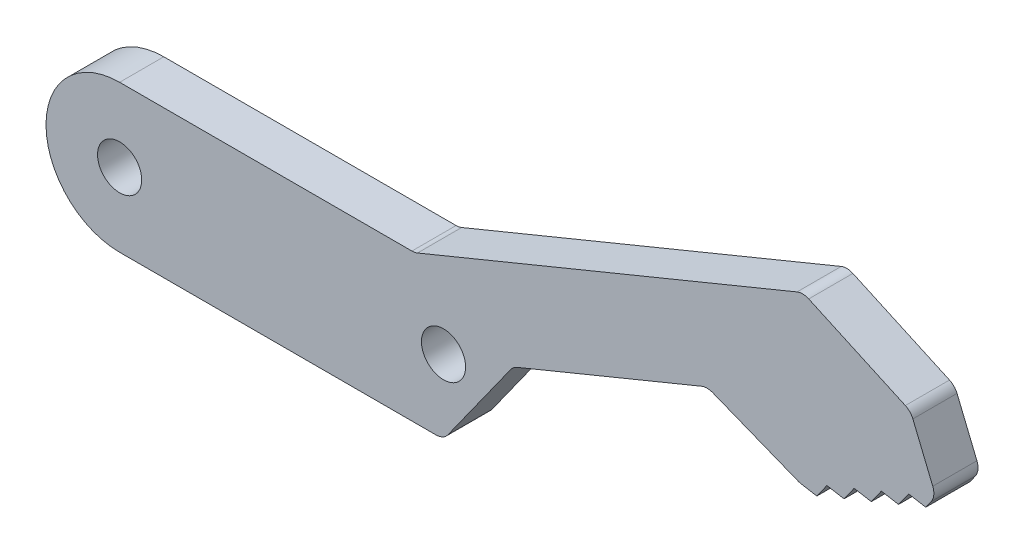
ISO-10303-21;
HEADER;
FILE_DESCRIPTION(('STEP AP214'),'2;1');
FILE_NAME('part.step','',(''),(''),'','','');
FILE_SCHEMA(('AUTOMOTIVE_DESIGN { 1 0 10303 214 1 1 1 1 }'));
ENDSEC;
DATA;
#1=APPLICATION_CONTEXT('core data for automotive mechanical design processes');
#2=APPLICATION_PROTOCOL_DEFINITION('international standard','automotive_design',2000,#1);
#3=PRODUCT_CONTEXT('',#1,'mechanical');
#4=PRODUCT('Part','Part','',(#3));
#5=PRODUCT_RELATED_PRODUCT_CATEGORY('part','',(#4));
#6=PRODUCT_DEFINITION_FORMATION('','',#4);
#7=PRODUCT_DEFINITION_CONTEXT('part definition',#1,'design');
#8=PRODUCT_DEFINITION('design','',#6,#7);
#9=PRODUCT_DEFINITION_SHAPE('','',#8);
#10=(LENGTH_UNIT() NAMED_UNIT(*) SI_UNIT(.MILLI.,.METRE.));
#11=(NAMED_UNIT(*) PLANE_ANGLE_UNIT() SI_UNIT($,.RADIAN.));
#12=(NAMED_UNIT(*) SI_UNIT($,.STERADIAN.) SOLID_ANGLE_UNIT());
#13=UNCERTAINTY_MEASURE_WITH_UNIT(LENGTH_MEASURE(1.E-05),#10,'distance_accuracy_value','');
#14=(GEOMETRIC_REPRESENTATION_CONTEXT(3) GLOBAL_UNCERTAINTY_ASSIGNED_CONTEXT((#13)) GLOBAL_UNIT_ASSIGNED_CONTEXT((#10,
#11,#12)) REPRESENTATION_CONTEXT('',''));
#15=CARTESIAN_POINT('',(0.,0.,0.));
#16=DIRECTION('',(0.,0.,1.));
#17=DIRECTION('',(1.,0.,0.));
#18=AXIS2_PLACEMENT_3D('',#15,#16,#17);
#19=CARTESIAN_POINT('',(0.,0.,1.5));
#20=DIRECTION('',(0.,0.,1.));
#21=DIRECTION('',(1.,0.,0.));
#22=AXIS2_PLACEMENT_3D('',#19,#20,#21);
#23=PLANE('',#22);
#24=CARTESIAN_POINT('',(0.,0.,1.5));
#25=DIRECTION('',(0.,0.,1.));
#26=DIRECTION('',(1.,0.,0.));
#27=AXIS2_PLACEMENT_3D('',#24,#25,#26);
#28=CIRCLE('',#27,1.5);
#29=CARTESIAN_POINT('',(1.5,0.,1.5));
#30=VERTEX_POINT('',#29);
#31=EDGE_CURVE('E413',#30,#30,#28,.T.);
#32=ORIENTED_EDGE('',*,*,#31,.F.);
#33=EDGE_LOOP('',(#32));
#34=FACE_BOUND('',#33,.T.);
#35=DIRECTION('',(0.929454882621317,-0.368935795459582,0.));
#36=VECTOR('',#35,1.);
#37=CARTESIAN_POINT('',(46.1884880253804,4.54000704246279,1.5));
#38=LINE('',#37,#36);
#39=CARTESIAN_POINT('',(40.2756885375187,6.8870207848566,1.5));
#40=VERTEX_POINT('',#39);
#41=CARTESIAN_POINT('',(46.0925277874036,4.57809729019016,1.5));
#42=VERTEX_POINT('',#41);
#43=EDGE_CURVE('E379',#40,#42,#38,.T.);
#44=ORIENTED_EDGE('',*,*,#43,.T.);
#45=CARTESIAN_POINT('',(46.4614635828631,5.50755217281148,1.5));
#46=DIRECTION('',(0.,0.,1.));
#47=DIRECTION('',(1.,0.,0.));
#48=AXIS2_PLACEMENT_3D('',#45,#46,#47);
#49=CIRCLE('',#48,1.);
#50=CARTESIAN_POINT('',(46.2902063078328,4.52232583041641,1.5));
#51=VERTEX_POINT('',#50);
#52=EDGE_CURVE('E307',#42,#51,#49,.T.);
#53=ORIENTED_EDGE('',*,*,#52,.T.);
#54=DIRECTION('',(0.985226342395072,-0.17125727503037,0.));
#55=VECTOR('',#54,1.);
#56=CARTESIAN_POINT('',(46.1884880253804,4.54000704246279,1.5));
#57=LINE('',#56,#55);
#58=CARTESIAN_POINT('',(47.3529322035688,4.33759717145107,1.5));
#59=VERTEX_POINT('',#58);
#60=EDGE_CURVE('E384',#51,#59,#57,.T.);
#61=ORIENTED_EDGE('',*,*,#60,.T.);
#62=DIRECTION('',(0.579836905746106,0.814732571298571,0.));
#63=VECTOR('',#62,1.);
#64=CARTESIAN_POINT('',(47.3529322035688,4.33759717145107,1.5));
#65=LINE('',#64,#63);
#66=CARTESIAN_POINT('',(48.0382444817134,5.3005338679292,1.5));
#67=VERTEX_POINT('',#66);
#68=EDGE_CURVE('E392',#59,#67,#65,.T.);
#69=ORIENTED_EDGE('',*,*,#68,.T.);
#70=DIRECTION('',(0.985226342395072,-0.171257275030373,0.));
#71=VECTOR('',#70,1.);
#72=CARTESIAN_POINT('',(48.0382444817134,5.3005338679292,1.5));
#73=LINE('',#72,#71);
#74=CARTESIAN_POINT('',(49.2026886599019,5.09812399691748,1.5));
#75=VERTEX_POINT('',#74);
#76=EDGE_CURVE('E395',#67,#75,#73,.T.);
#77=ORIENTED_EDGE('',*,*,#76,.T.);
#78=DIRECTION('',(0.579836905746101,0.814732571298575,0.));
#79=VECTOR('',#78,1.);
#80=CARTESIAN_POINT('',(49.2026886599019,5.09812399691748,1.5));
#81=LINE('',#80,#79);
#82=CARTESIAN_POINT('',(49.8880009380465,6.06106069339563,1.5));
#83=VERTEX_POINT('',#82);
#84=EDGE_CURVE('E398',#75,#83,#81,.T.);
#85=ORIENTED_EDGE('',*,*,#84,.T.);
#86=DIRECTION('',(0.98522634239507,-0.171257275030381,0.));
#87=VECTOR('',#86,1.);
#88=CARTESIAN_POINT('',(49.8880009380465,6.06106069339563,1.5));
#89=LINE('',#88,#87);
#90=CARTESIAN_POINT('',(51.052445116235,5.85865082238389,1.5));
#91=VERTEX_POINT('',#90);
#92=EDGE_CURVE('E401',#83,#91,#89,.T.);
#93=ORIENTED_EDGE('',*,*,#92,.T.);
#94=DIRECTION('',(0.579836905746102,0.814732571298574,0.));
#95=VECTOR('',#94,1.);
#96=CARTESIAN_POINT('',(51.052445116235,5.85865082238389,1.5));
#97=LINE('',#96,#95);
#98=CARTESIAN_POINT('',(51.7377573943796,6.82158751886203,1.5));
#99=VERTEX_POINT('',#98);
#100=EDGE_CURVE('E404',#91,#99,#97,.T.);
#101=ORIENTED_EDGE('',*,*,#100,.T.);
#102=DIRECTION('',(0.985226342395074,-0.171257275030362,0.));
#103=VECTOR('',#102,1.);
#104=CARTESIAN_POINT('',(51.7377573943796,6.82158751886203,1.5));
#105=LINE('',#104,#103);
#106=CARTESIAN_POINT('',(52.9022015725681,6.61917764785031,1.5));
#107=VERTEX_POINT('',#106);
#108=EDGE_CURVE('E241',#99,#107,#105,.T.);
#109=ORIENTED_EDGE('',*,*,#108,.T.);
#110=DIRECTION('',(0.579836905746106,0.814732571298571,0.));
#111=VECTOR('',#110,1.);
#112=CARTESIAN_POINT('',(52.9022015725681,6.61917764785031,1.5));
#113=LINE('',#112,#111);
#114=CARTESIAN_POINT('',(53.5875138507128,7.58211434432844,1.5));
#115=VERTEX_POINT('',#114);
#116=EDGE_CURVE('E235',#107,#115,#113,.T.);
#117=ORIENTED_EDGE('',*,*,#116,.T.);
#118=DIRECTION('',(0.98522634239507,-0.171257275030384,0.));
#119=VECTOR('',#118,1.);
#120=CARTESIAN_POINT('',(53.5875138507128,7.58211434432844,1.5));
#121=LINE('',#120,#119);
#122=CARTESIAN_POINT('',(54.7519580289012,7.37970447331671,1.5));
#123=VERTEX_POINT('',#122);
#124=EDGE_CURVE('E223',#115,#123,#121,.T.);
#125=ORIENTED_EDGE('',*,*,#124,.T.);
#126=DIRECTION('',(0.579836905746103,0.814732571298573,0.));
#127=VECTOR('',#126,1.);
#128=CARTESIAN_POINT('',(54.7519580289012,7.37970447331671,1.5));
#129=LINE('',#128,#127);
#130=CARTESIAN_POINT('',(55.1172552795213,7.89298599323483,1.5));
#131=VERTEX_POINT('',#130);
#132=EDGE_CURVE('E234',#123,#131,#129,.T.);
#133=ORIENTED_EDGE('',*,*,#132,.T.);
#134=CARTESIAN_POINT('',(54.3025227082227,8.47282289898093,1.5));
#135=DIRECTION('',(0.,0.,1.));
#136=DIRECTION('',(1.,0.,0.));
#137=AXIS2_PLACEMENT_3D('',#134,#135,#136);
#138=CIRCLE('',#137,1.);
#139=CARTESIAN_POINT('',(55.2274009363892,8.85308631171413,1.5));
#140=VERTEX_POINT('',#139);
#141=EDGE_CURVE('E295',#131,#140,#138,.T.);
#142=ORIENTED_EDGE('',*,*,#141,.T.);
#143=DIRECTION('',(-0.380263412733207,0.924878228166549,0.));
#144=VECTOR('',#143,1.);
#145=CARTESIAN_POINT('',(53.7260849497464,12.5045931965443,1.5));
#146=LINE('',#145,#144);
#147=CARTESIAN_POINT('',(53.8764912996726,12.138774256918,1.5));
#148=VERTEX_POINT('',#147);
#149=EDGE_CURVE('E532',#140,#148,#146,.T.);
#150=ORIENTED_EDGE('',*,*,#149,.T.);
#151=CARTESIAN_POINT('',(52.9516130715061,11.7585108441848,1.5));
#152=DIRECTION('',(0.,0.,1.));
#153=DIRECTION('',(1.,0.,0.));
#154=AXIS2_PLACEMENT_3D('',#151,#152,#153);
#155=CIRCLE('',#154,1.);
#156=CARTESIAN_POINT('',(53.3661353314382,12.6685500169795,1.5));
#157=VERTEX_POINT('',#156);
#158=EDGE_CURVE('E298',#148,#157,#155,.T.);
#159=ORIENTED_EDGE('',*,*,#158,.T.);
#160=DIRECTION('',(-0.910039172794664,0.414522259932086,0.));
#161=VECTOR('',#160,1.);
#162=CARTESIAN_POINT('',(46.4090295027466,15.8375072628964,1.5));
#163=LINE('',#162,#161);
#164=CARTESIAN_POINT('',(46.8032086062433,15.6579589338968,1.5));
#165=VERTEX_POINT('',#164);
#166=EDGE_CURVE('E528',#157,#165,#163,.T.);
#167=ORIENTED_EDGE('',*,*,#166,.T.);
#168=CARTESIAN_POINT('',(46.3886863463112,14.7479197611021,1.5));
#169=DIRECTION('',(0.,0.,1.));
#170=DIRECTION('',(1.,0.,0.));
#171=AXIS2_PLACEMENT_3D('',#168,#169,#170);
#172=CIRCLE('',#171,1.);
#173=CARTESIAN_POINT('',(46.008422933578,15.6727979892687,1.5));
#174=VERTEX_POINT('',#173);
#175=EDGE_CURVE('E301',#165,#174,#172,.T.);
#176=ORIENTED_EDGE('',*,*,#175,.T.);
#177=DIRECTION('',(-0.924878228166549,-0.380263412733207,0.));
#178=VECTOR('',#177,1.);
#179=CARTESIAN_POINT('',(20.05,5.,1.5));
#180=LINE('',#179,#178);
#181=CARTESIAN_POINT('',(20.2327114807882,5.07512177183345,1.5));
#182=VERTEX_POINT('',#181);
#183=EDGE_CURVE('E524',#174,#182,#180,.T.);
#184=ORIENTED_EDGE('',*,*,#183,.T.);
#185=CARTESIAN_POINT('',(19.852448068055,6.,1.5));
#186=DIRECTION('',(0.,0.,1.));
#187=DIRECTION('',(1.,0.,0.));
#188=AXIS2_PLACEMENT_3D('',#185,#186,#187);
#189=CIRCLE('',#188,1.);
#190=CARTESIAN_POINT('',(19.852448068055,5.,1.5));
#191=VERTEX_POINT('',#190);
#192=EDGE_CURVE('E346',#182,#191,#189,.F.);
#193=ORIENTED_EDGE('',*,*,#192,.T.);
#194=DIRECTION('',(-1.,0.,0.));
#195=VECTOR('',#194,1.);
#196=CARTESIAN_POINT('',(0.,5.,1.5));
#197=LINE('',#196,#195);
#198=CARTESIAN_POINT('',(0.,5.,1.5));
#199=VERTEX_POINT('',#198);
#200=EDGE_CURVE('E519',#191,#199,#197,.T.);
#201=ORIENTED_EDGE('',*,*,#200,.T.);
#202=CARTESIAN_POINT('',(0.,0.,1.5));
#203=DIRECTION('',(0.,0.,1.));
#204=DIRECTION('',(1.,0.,0.));
#205=AXIS2_PLACEMENT_3D('',#202,#203,#204);
#206=CIRCLE('',#205,5.);
#207=CARTESIAN_POINT('',(0.,-5.,1.5));
#208=VERTEX_POINT('',#207);
#209=EDGE_CURVE('E504',#199,#208,#206,.T.);
#210=ORIENTED_EDGE('',*,*,#209,.T.);
#211=DIRECTION('',(1.,0.,0.));
#212=VECTOR('',#211,1.);
#213=CARTESIAN_POINT('',(0.,-5.,1.5));
#214=LINE('',#213,#212);
#215=CARTESIAN_POINT('',(21.4854150030195,-5.,1.5));
#216=VERTEX_POINT('',#215);
#217=EDGE_CURVE('E386',#208,#216,#214,.T.);
#218=ORIENTED_EDGE('',*,*,#217,.T.);
#219=CARTESIAN_POINT('',(21.4854150030195,-4.,1.5));
#220=DIRECTION('',(0.,0.,1.));
#221=DIRECTION('',(1.,0.,0.));
#222=AXIS2_PLACEMENT_3D('',#219,#220,#221);
#223=CIRCLE('',#222,1.);
#224=CARTESIAN_POINT('',(22.2991182366711,-4.58128052396836,1.5));
#225=VERTEX_POINT('',#224);
#226=EDGE_CURVE('E304',#216,#225,#223,.T.);
#227=ORIENTED_EDGE('',*,*,#226,.T.);
#228=DIRECTION('',(0.581280523968354,0.813703233651603,0.));
#229=VECTOR('',#228,1.);
#230=CARTESIAN_POINT('',(26.7298984201175,1.62112952455076,1.5));
#231=LINE('',#230,#229);
#232=CARTESIAN_POINT('',(26.562618493048,1.38696338278466,1.5));
#233=VERTEX_POINT('',#232);
#234=EDGE_CURVE('E380',#225,#233,#231,.T.);
#235=ORIENTED_EDGE('',*,*,#234,.T.);
#236=CARTESIAN_POINT('',(27.3763217266996,0.805682858816303,1.5));
#237=DIRECTION('',(0.,0.,1.));
#238=DIRECTION('',(1.,0.,0.));
#239=AXIS2_PLACEMENT_3D('',#236,#237,#238);
#240=CIRCLE('',#239,1.);
#241=CARTESIAN_POINT('',(26.9960583139664,1.73056108698285,1.5));
#242=VERTEX_POINT('',#241);
#243=EDGE_CURVE('E11',#233,#242,#240,.F.);
#244=ORIENTED_EDGE('',*,*,#243,.T.);
#245=DIRECTION('',(0.924878228166549,0.380263412733207,0.));
#246=VECTOR('',#245,1.);
#247=CARTESIAN_POINT('',(39.9001643892091,7.03608052187162,1.5));
#248=LINE('',#247,#246);
#249=CARTESIAN_POINT('',(39.5264893293259,6.88244413040182,1.5));
#250=VERTEX_POINT('',#249);
#251=EDGE_CURVE('E376',#242,#250,#248,.T.);
#252=ORIENTED_EDGE('',*,*,#251,.T.);
#253=CARTESIAN_POINT('',(39.9067527420591,5.95756590223528,1.5));
#254=DIRECTION('',(0.,0.,1.));
#255=DIRECTION('',(1.,0.,0.));
#256=AXIS2_PLACEMENT_3D('',#253,#254,#255);
#257=CIRCLE('',#256,1.);
#258=EDGE_CURVE('E352',#250,#40,#257,.F.);
#259=ORIENTED_EDGE('',*,*,#258,.T.);
#260=EDGE_LOOP('',(#44,#53,#61,#69,#77,#85,#93,#101,#109,#117,#125,#133,#142,#150,#159,#167,
#176,#184,#193,#201,#210,#218,#227,#235,#244,#252,#259));
#261=FACE_BOUND('',#260,.T.);
#262=CARTESIAN_POINT('',(22.,0.,1.5));
#263=DIRECTION('',(0.,0.,1.));
#264=DIRECTION('',(1.,0.,0.));
#265=AXIS2_PLACEMENT_3D('',#262,#263,#264);
#266=CIRCLE('',#265,1.5);
#267=CARTESIAN_POINT('',(23.5,0.,1.5));
#268=VERTEX_POINT('',#267);
#269=EDGE_CURVE('E542',#268,#268,#266,.T.);
#270=ORIENTED_EDGE('',*,*,#269,.F.);
#271=EDGE_LOOP('',(#270));
#272=FACE_BOUND('',#271,.T.);
#273=ADVANCED_FACE('F43',(#34,#261,#272),#23,.T.);
#274=CARTESIAN_POINT('',(0.,0.,-1.5));
#275=DIRECTION('',(0.,0.,1.));
#276=DIRECTION('',(1.,0.,0.));
#277=AXIS2_PLACEMENT_3D('',#274,#275,#276);
#278=PLANE('',#277);
#279=DIRECTION('',(0.985226342395072,-0.17125727503037,0.));
#280=VECTOR('',#279,1.);
#281=CARTESIAN_POINT('',(46.1884880253804,4.54000704246279,-1.5));
#282=LINE('',#281,#280);
#283=CARTESIAN_POINT('',(46.2902063078328,4.52232583041641,-1.5));
#284=VERTEX_POINT('',#283);
#285=CARTESIAN_POINT('',(47.3529322035688,4.33759717145107,-1.5));
#286=VERTEX_POINT('',#285);
#287=EDGE_CURVE('E447',#284,#286,#282,.T.);
#288=ORIENTED_EDGE('',*,*,#287,.F.);
#289=CARTESIAN_POINT('',(46.4614635828631,5.50755217281148,-1.5));
#290=DIRECTION('',(0.,0.,1.));
#291=DIRECTION('',(1.,0.,0.));
#292=AXIS2_PLACEMENT_3D('',#289,#290,#291);
#293=CIRCLE('',#292,1.);
#294=CARTESIAN_POINT('',(46.0925277874036,4.57809729019016,-1.5));
#295=VERTEX_POINT('',#294);
#296=EDGE_CURVE('E285',#284,#295,#293,.F.);
#297=ORIENTED_EDGE('',*,*,#296,.T.);
#298=DIRECTION('',(0.929454882621317,-0.368935795459582,0.));
#299=VECTOR('',#298,1.);
#300=CARTESIAN_POINT('',(46.1884880253804,4.54000704246279,-1.5));
#301=LINE('',#300,#299);
#302=CARTESIAN_POINT('',(40.2756885375187,6.8870207848566,-1.5));
#303=VERTEX_POINT('',#302);
#304=EDGE_CURVE('E443',#303,#295,#301,.T.);
#305=ORIENTED_EDGE('',*,*,#304,.F.);
#306=CARTESIAN_POINT('',(39.9067527420591,5.95756590223528,-1.5));
#307=DIRECTION('',(0.,0.,1.));
#308=DIRECTION('',(1.,0.,0.));
#309=AXIS2_PLACEMENT_3D('',#306,#307,#308);
#310=CIRCLE('',#309,1.);
#311=CARTESIAN_POINT('',(39.5264893293259,6.88244413040182,-1.5));
#312=VERTEX_POINT('',#311);
#313=EDGE_CURVE('E349',#303,#312,#310,.T.);
#314=ORIENTED_EDGE('',*,*,#313,.T.);
#315=DIRECTION('',(0.924878228166549,0.380263412733207,0.));
#316=VECTOR('',#315,1.);
#317=CARTESIAN_POINT('',(39.9001643892091,7.03608052187162,-1.5));
#318=LINE('',#317,#316);
#319=CARTESIAN_POINT('',(26.9960583139664,1.73056108698285,-1.5));
#320=VERTEX_POINT('',#319);
#321=EDGE_CURVE('E363',#320,#312,#318,.T.);
#322=ORIENTED_EDGE('',*,*,#321,.F.);
#323=CARTESIAN_POINT('',(27.3763217266996,0.805682858816303,-1.5));
#324=DIRECTION('',(0.,0.,1.));
#325=DIRECTION('',(1.,0.,0.));
#326=AXIS2_PLACEMENT_3D('',#323,#324,#325);
#327=CIRCLE('',#326,1.);
#328=CARTESIAN_POINT('',(26.562618493048,1.38696338278466,-1.5));
#329=VERTEX_POINT('',#328);
#330=EDGE_CURVE('E52',#320,#329,#327,.T.);
#331=ORIENTED_EDGE('',*,*,#330,.T.);
#332=DIRECTION('',(0.581280523968354,0.813703233651603,0.));
#333=VECTOR('',#332,1.);
#334=CARTESIAN_POINT('',(26.7298984201175,1.62112952455076,-1.5));
#335=LINE('',#334,#333);
#336=CARTESIAN_POINT('',(22.2991182366711,-4.58128052396836,-1.5));
#337=VERTEX_POINT('',#336);
#338=EDGE_CURVE('E362',#337,#329,#335,.T.);
#339=ORIENTED_EDGE('',*,*,#338,.F.);
#340=CARTESIAN_POINT('',(21.4854150030195,-4.,-1.5));
#341=DIRECTION('',(0.,0.,1.));
#342=DIRECTION('',(1.,0.,0.));
#343=AXIS2_PLACEMENT_3D('',#340,#341,#342);
#344=CIRCLE('',#343,1.);
#345=CARTESIAN_POINT('',(21.4854150030195,-5.,-1.5));
#346=VERTEX_POINT('',#345);
#347=EDGE_CURVE('E282',#337,#346,#344,.F.);
#348=ORIENTED_EDGE('',*,*,#347,.T.);
#349=DIRECTION('',(1.,0.,0.));
#350=VECTOR('',#349,1.);
#351=CARTESIAN_POINT('',(0.,-5.,-1.5));
#352=LINE('',#351,#350);
#353=CARTESIAN_POINT('',(0.,-5.,-1.5));
#354=VERTEX_POINT('',#353);
#355=EDGE_CURVE('E372',#354,#346,#352,.T.);
#356=ORIENTED_EDGE('',*,*,#355,.F.);
#357=CARTESIAN_POINT('',(0.,0.,-1.5));
#358=DIRECTION('',(0.,0.,1.));
#359=DIRECTION('',(1.,0.,0.));
#360=AXIS2_PLACEMENT_3D('',#357,#358,#359);
#361=CIRCLE('',#360,5.);
#362=CARTESIAN_POINT('',(0.,5.,-1.5));
#363=VERTEX_POINT('',#362);
#364=EDGE_CURVE('E435',#363,#354,#361,.T.);
#365=ORIENTED_EDGE('',*,*,#364,.F.);
#366=DIRECTION('',(-1.,0.,0.));
#367=VECTOR('',#366,1.);
#368=CARTESIAN_POINT('',(0.,5.,-1.5));
#369=LINE('',#368,#367);
#370=CARTESIAN_POINT('',(19.852448068055,5.,-1.5));
#371=VERTEX_POINT('',#370);
#372=EDGE_CURVE('E432',#371,#363,#369,.T.);
#373=ORIENTED_EDGE('',*,*,#372,.F.);
#374=CARTESIAN_POINT('',(19.852448068055,6.,-1.5));
#375=DIRECTION('',(0.,0.,1.));
#376=DIRECTION('',(1.,0.,0.));
#377=AXIS2_PLACEMENT_3D('',#374,#375,#376);
#378=CIRCLE('',#377,1.);
#379=CARTESIAN_POINT('',(20.2327114807882,5.07512177183345,-1.5));
#380=VERTEX_POINT('',#379);
#381=EDGE_CURVE('E343',#371,#380,#378,.T.);
#382=ORIENTED_EDGE('',*,*,#381,.T.);
#383=DIRECTION('',(-0.924878228166549,-0.380263412733207,0.));
#384=VECTOR('',#383,1.);
#385=CARTESIAN_POINT('',(20.05,5.,-1.5));
#386=LINE('',#385,#384);
#387=CARTESIAN_POINT('',(46.008422933578,15.6727979892687,-1.5));
#388=VERTEX_POINT('',#387);
#389=EDGE_CURVE('E428',#388,#380,#386,.T.);
#390=ORIENTED_EDGE('',*,*,#389,.F.);
#391=CARTESIAN_POINT('',(46.3886863463112,14.7479197611021,-1.5));
#392=DIRECTION('',(0.,0.,1.));
#393=DIRECTION('',(1.,0.,0.));
#394=AXIS2_PLACEMENT_3D('',#391,#392,#393);
#395=CIRCLE('',#394,1.);
#396=CARTESIAN_POINT('',(46.8032086062433,15.6579589338968,-1.5));
#397=VERTEX_POINT('',#396);
#398=EDGE_CURVE('E279',#388,#397,#395,.F.);
#399=ORIENTED_EDGE('',*,*,#398,.T.);
#400=DIRECTION('',(-0.910039172794664,0.414522259932086,0.));
#401=VECTOR('',#400,1.);
#402=CARTESIAN_POINT('',(46.4090295027466,15.8375072628964,-1.5));
#403=LINE('',#402,#401);
#404=CARTESIAN_POINT('',(53.3661353314382,12.6685500169795,-1.5));
#405=VERTEX_POINT('',#404);
#406=EDGE_CURVE('E424',#405,#397,#403,.T.);
#407=ORIENTED_EDGE('',*,*,#406,.F.);
#408=CARTESIAN_POINT('',(52.9516130715061,11.7585108441848,-1.5));
#409=DIRECTION('',(0.,0.,1.));
#410=DIRECTION('',(1.,0.,0.));
#411=AXIS2_PLACEMENT_3D('',#408,#409,#410);
#412=CIRCLE('',#411,1.);
#413=CARTESIAN_POINT('',(53.8764912996726,12.138774256918,-1.5));
#414=VERTEX_POINT('',#413);
#415=EDGE_CURVE('E276',#405,#414,#412,.F.);
#416=ORIENTED_EDGE('',*,*,#415,.T.);
#417=DIRECTION('',(-0.380263412733207,0.924878228166549,0.));
#418=VECTOR('',#417,1.);
#419=CARTESIAN_POINT('',(53.7260849497464,12.5045931965443,-1.5));
#420=LINE('',#419,#418);
#421=CARTESIAN_POINT('',(55.2274009363892,8.85308631171413,-1.5));
#422=VERTEX_POINT('',#421);
#423=EDGE_CURVE('E420',#422,#414,#420,.T.);
#424=ORIENTED_EDGE('',*,*,#423,.F.);
#425=CARTESIAN_POINT('',(54.3025227082227,8.47282289898093,-1.5));
#426=DIRECTION('',(0.,0.,1.));
#427=DIRECTION('',(1.,0.,0.));
#428=AXIS2_PLACEMENT_3D('',#425,#426,#427);
#429=CIRCLE('',#428,1.);
#430=CARTESIAN_POINT('',(55.1172552795213,7.89298599323483,-1.5));
#431=VERTEX_POINT('',#430);
#432=EDGE_CURVE('E273',#422,#431,#429,.F.);
#433=ORIENTED_EDGE('',*,*,#432,.T.);
#434=DIRECTION('',(0.579836905746103,0.814732571298573,0.));
#435=VECTOR('',#434,1.);
#436=CARTESIAN_POINT('',(54.7519580289012,7.37970447331671,-1.5));
#437=LINE('',#436,#435);
#438=CARTESIAN_POINT('',(54.7519580289012,7.37970447331671,-1.5));
#439=VERTEX_POINT('',#438);
#440=EDGE_CURVE('E416',#439,#431,#437,.T.);
#441=ORIENTED_EDGE('',*,*,#440,.F.);
#442=DIRECTION('',(0.98522634239507,-0.171257275030384,0.));
#443=VECTOR('',#442,1.);
#444=CARTESIAN_POINT('',(53.5875138507128,7.58211434432844,-1.5));
#445=LINE('',#444,#443);
#446=CARTESIAN_POINT('',(53.5875138507128,7.58211434432844,-1.5));
#447=VERTEX_POINT('',#446);
#448=EDGE_CURVE('E412',#447,#439,#445,.T.);
#449=ORIENTED_EDGE('',*,*,#448,.F.);
#450=DIRECTION('',(0.579836905746106,0.814732571298571,0.));
#451=VECTOR('',#450,1.);
#452=CARTESIAN_POINT('',(52.9022015725681,6.61917764785031,-1.5));
#453=LINE('',#452,#451);
#454=CARTESIAN_POINT('',(52.9022015725681,6.61917764785031,-1.5));
#455=VERTEX_POINT('',#454);
#456=EDGE_CURVE('E250',#455,#447,#453,.T.);
#457=ORIENTED_EDGE('',*,*,#456,.F.);
#458=DIRECTION('',(0.985226342395074,-0.171257275030362,0.));
#459=VECTOR('',#458,1.);
#460=CARTESIAN_POINT('',(51.7377573943796,6.82158751886203,-1.5));
#461=LINE('',#460,#459);
#462=CARTESIAN_POINT('',(51.7377573943796,6.82158751886203,-1.5));
#463=VERTEX_POINT('',#462);
#464=EDGE_CURVE('E246',#463,#455,#461,.T.);
#465=ORIENTED_EDGE('',*,*,#464,.F.);
#466=DIRECTION('',(0.579836905746102,0.814732571298574,0.));
#467=VECTOR('',#466,1.);
#468=CARTESIAN_POINT('',(51.052445116235,5.85865082238389,-1.5));
#469=LINE('',#468,#467);
#470=CARTESIAN_POINT('',(51.052445116235,5.85865082238389,-1.5));
#471=VERTEX_POINT('',#470);
#472=EDGE_CURVE('E462',#471,#463,#469,.T.);
#473=ORIENTED_EDGE('',*,*,#472,.F.);
#474=DIRECTION('',(0.98522634239507,-0.171257275030381,0.));
#475=VECTOR('',#474,1.);
#476=CARTESIAN_POINT('',(49.8880009380465,6.06106069339563,-1.5));
#477=LINE('',#476,#475);
#478=CARTESIAN_POINT('',(49.8880009380465,6.06106069339563,-1.5));
#479=VERTEX_POINT('',#478);
#480=EDGE_CURVE('E459',#479,#471,#477,.T.);
#481=ORIENTED_EDGE('',*,*,#480,.F.);
#482=DIRECTION('',(0.579836905746101,0.814732571298575,0.));
#483=VECTOR('',#482,1.);
#484=CARTESIAN_POINT('',(49.2026886599019,5.09812399691748,-1.5));
#485=LINE('',#484,#483);
#486=CARTESIAN_POINT('',(49.2026886599019,5.09812399691748,-1.5));
#487=VERTEX_POINT('',#486);
#488=EDGE_CURVE('E456',#487,#479,#485,.T.);
#489=ORIENTED_EDGE('',*,*,#488,.F.);
#490=DIRECTION('',(0.985226342395072,-0.171257275030373,0.));
#491=VECTOR('',#490,1.);
#492=CARTESIAN_POINT('',(48.0382444817134,5.3005338679292,-1.5));
#493=LINE('',#492,#491);
#494=CARTESIAN_POINT('',(48.0382444817134,5.3005338679292,-1.5));
#495=VERTEX_POINT('',#494);
#496=EDGE_CURVE('E453',#495,#487,#493,.T.);
#497=ORIENTED_EDGE('',*,*,#496,.F.);
#498=DIRECTION('',(0.579836905746106,0.814732571298571,0.));
#499=VECTOR('',#498,1.);
#500=CARTESIAN_POINT('',(47.3529322035688,4.33759717145107,-1.5));
#501=LINE('',#500,#499);
#502=EDGE_CURVE('E450',#286,#495,#501,.T.);
#503=ORIENTED_EDGE('',*,*,#502,.F.);
#504=EDGE_LOOP('',(#288,#297,#305,#314,#322,#331,#339,#348,#356,#365,#373,#382,#390,#399,#407,
#416,#424,#433,#441,#449,#457,#465,#473,#481,#489,#497,#503));
#505=FACE_BOUND('',#504,.T.);
#506=CARTESIAN_POINT('',(0.,0.,-1.5));
#507=DIRECTION('',(0.,0.,1.));
#508=DIRECTION('',(1.,0.,0.));
#509=AXIS2_PLACEMENT_3D('',#506,#507,#508);
#510=CIRCLE('',#509,1.5);
#511=CARTESIAN_POINT('',(1.5,0.,-1.5));
#512=VERTEX_POINT('',#511);
#513=EDGE_CURVE('E538',#512,#512,#510,.T.);
#514=ORIENTED_EDGE('',*,*,#513,.T.);
#515=EDGE_LOOP('',(#514));
#516=FACE_BOUND('',#515,.T.);
#517=CARTESIAN_POINT('',(22.,0.,-1.5));
#518=DIRECTION('',(0.,0.,1.));
#519=DIRECTION('',(1.,0.,0.));
#520=AXIS2_PLACEMENT_3D('',#517,#518,#519);
#521=CIRCLE('',#520,1.5);
#522=CARTESIAN_POINT('',(23.5,0.,-1.5));
#523=VERTEX_POINT('',#522);
#524=EDGE_CURVE('E546',#523,#523,#521,.T.);
#525=ORIENTED_EDGE('',*,*,#524,.T.);
#526=EDGE_LOOP('',(#525));
#527=FACE_BOUND('',#526,.T.);
#528=ADVANCED_FACE('F360',(#505,#516,#527),#278,.F.);
#529=CARTESIAN_POINT('',(52.9022015725681,6.61917764785031,1.5));
#530=DIRECTION('',(-0.814732571298571,0.579836905746106,0.));
#531=DIRECTION('',(-0.579836905746106,-0.814732571298571,0.));
#532=AXIS2_PLACEMENT_3D('',#529,#530,#531);
#533=PLANE('',#532);
#534=ORIENTED_EDGE('',*,*,#456,.T.);
#535=DIRECTION('',(0.,0.,-1.));
#536=VECTOR('',#535,1.);
#537=CARTESIAN_POINT('',(53.5875138507128,7.58211434432844,1.5));
#538=LINE('',#537,#536);
#539=EDGE_CURVE('E227',#115,#447,#538,.T.);
#540=ORIENTED_EDGE('',*,*,#539,.F.);
#541=ORIENTED_EDGE('',*,*,#116,.F.);
#542=DIRECTION('',(0.,0.,-1.));
#543=VECTOR('',#542,1.);
#544=CARTESIAN_POINT('',(52.9022015725681,6.61917764785031,1.5));
#545=LINE('',#544,#543);
#546=EDGE_CURVE('E409',#107,#455,#545,.T.);
#547=ORIENTED_EDGE('',*,*,#546,.T.);
#548=EDGE_LOOP('',(#534,#540,#541,#547));
#549=FACE_BOUND('',#548,.T.);
#550=ADVANCED_FACE('F248',(#549),#533,.F.);
#551=CARTESIAN_POINT('',(53.5875138507128,7.58211434432844,1.5));
#552=DIRECTION('',(0.171257275030384,0.98522634239507,0.));
#553=DIRECTION('',(-0.98522634239507,0.171257275030384,0.));
#554=AXIS2_PLACEMENT_3D('',#551,#552,#553);
#555=PLANE('',#554);
#556=ORIENTED_EDGE('',*,*,#448,.T.);
#557=DIRECTION('',(0.,0.,-1.));
#558=VECTOR('',#557,1.);
#559=CARTESIAN_POINT('',(54.7519580289012,7.37970447331671,1.5));
#560=LINE('',#559,#558);
#561=EDGE_CURVE('E230',#123,#439,#560,.T.);
#562=ORIENTED_EDGE('',*,*,#561,.F.);
#563=ORIENTED_EDGE('',*,*,#124,.F.);
#564=ORIENTED_EDGE('',*,*,#539,.T.);
#565=EDGE_LOOP('',(#556,#562,#563,#564));
#566=FACE_BOUND('',#565,.T.);
#567=ADVANCED_FACE('F225',(#566),#555,.F.);
#568=CARTESIAN_POINT('',(54.7519580289012,7.37970447331671,1.5));
#569=DIRECTION('',(-0.814732571298573,0.579836905746103,0.));
#570=DIRECTION('',(-0.579836905746104,-0.814732571298573,0.));
#571=AXIS2_PLACEMENT_3D('',#568,#569,#570);
#572=PLANE('',#571);
#573=ORIENTED_EDGE('',*,*,#440,.T.);
#574=DIRECTION('',(0.,0.,-1.));
#575=VECTOR('',#574,1.);
#576=CARTESIAN_POINT('',(55.1172552795213,7.89298599323483,1.5));
#577=LINE('',#576,#575);
#578=EDGE_CURVE('E340',#431,#131,#577,.F.);
#579=ORIENTED_EDGE('',*,*,#578,.T.);
#580=ORIENTED_EDGE('',*,*,#132,.F.);
#581=ORIENTED_EDGE('',*,*,#561,.T.);
#582=EDGE_LOOP('',(#573,#579,#580,#581));
#583=FACE_BOUND('',#582,.T.);
#584=ADVANCED_FACE('F622',(#583),#572,.F.);
#585=CARTESIAN_POINT('',(53.7260849497464,12.5045931965443,1.5));
#586=DIRECTION('',(-0.924878228166549,-0.380263412733207,0.));
#587=DIRECTION('',(0.380263412733207,-0.924878228166549,0.));
#588=AXIS2_PLACEMENT_3D('',#585,#586,#587);
#589=PLANE('',#588);
#590=ORIENTED_EDGE('',*,*,#423,.T.);
#591=DIRECTION('',(0.,0.,-1.));
#592=VECTOR('',#591,1.);
#593=CARTESIAN_POINT('',(53.8764912996726,12.138774256918,1.5));
#594=LINE('',#593,#592);
#595=EDGE_CURVE('E337',#414,#148,#594,.F.);
#596=ORIENTED_EDGE('',*,*,#595,.T.);
#597=ORIENTED_EDGE('',*,*,#149,.F.);
#598=DIRECTION('',(0.,0.,-1.));
#599=VECTOR('',#598,1.);
#600=CARTESIAN_POINT('',(55.2274009363892,8.85308631171413,1.5));
#601=LINE('',#600,#599);
#602=EDGE_CURVE('E333',#140,#422,#601,.T.);
#603=ORIENTED_EDGE('',*,*,#602,.T.);
#604=EDGE_LOOP('',(#590,#596,#597,#603));
#605=FACE_BOUND('',#604,.T.);
#606=ADVANCED_FACE('F618',(#605),#589,.F.);
#607=CARTESIAN_POINT('',(46.4090295027466,15.8375072628964,1.5));
#608=DIRECTION('',(-0.414522259932086,-0.910039172794664,0.));
#609=DIRECTION('',(0.910039172794664,-0.414522259932086,0.));
#610=AXIS2_PLACEMENT_3D('',#607,#608,#609);
#611=PLANE('',#610);
#612=ORIENTED_EDGE('',*,*,#406,.T.);
#613=DIRECTION('',(0.,0.,-1.));
#614=VECTOR('',#613,1.);
#615=CARTESIAN_POINT('',(46.8032086062433,15.6579589338968,1.5));
#616=LINE('',#615,#614);
#617=EDGE_CURVE('E330',#397,#165,#616,.F.);
#618=ORIENTED_EDGE('',*,*,#617,.T.);
#619=ORIENTED_EDGE('',*,*,#166,.F.);
#620=DIRECTION('',(0.,0.,-1.));
#621=VECTOR('',#620,1.);
#622=CARTESIAN_POINT('',(53.3661353314382,12.6685500169795,1.5));
#623=LINE('',#622,#621);
#624=EDGE_CURVE('E326',#157,#405,#623,.T.);
#625=ORIENTED_EDGE('',*,*,#624,.T.);
#626=EDGE_LOOP('',(#612,#618,#619,#625));
#627=FACE_BOUND('',#626,.T.);
#628=ADVANCED_FACE('F614',(#627),#611,.F.);
#629=CARTESIAN_POINT('',(20.05,5.,1.5));
#630=DIRECTION('',(0.380263412733207,-0.924878228166549,0.));
#631=DIRECTION('',(0.924878228166549,0.380263412733207,0.));
#632=AXIS2_PLACEMENT_3D('',#629,#630,#631);
#633=PLANE('',#632);
#634=ORIENTED_EDGE('',*,*,#389,.T.);
#635=DIRECTION('',(0.,0.,-1.));
#636=VECTOR('',#635,1.);
#637=CARTESIAN_POINT('',(20.2327114807882,5.07512177183345,1.5));
#638=LINE('',#637,#636);
#639=EDGE_CURVE('E266',#380,#182,#638,.F.);
#640=ORIENTED_EDGE('',*,*,#639,.T.);
#641=ORIENTED_EDGE('',*,*,#183,.F.);
#642=DIRECTION('',(0.,0.,-1.));
#643=VECTOR('',#642,1.);
#644=CARTESIAN_POINT('',(46.008422933578,15.6727979892687,1.5));
#645=LINE('',#644,#643);
#646=EDGE_CURVE('E257',#174,#388,#645,.T.);
#647=ORIENTED_EDGE('',*,*,#646,.T.);
#648=EDGE_LOOP('',(#634,#640,#641,#647));
#649=FACE_BOUND('',#648,.T.);
#650=ADVANCED_FACE('F611',(#649),#633,.F.);
#651=CARTESIAN_POINT('',(0.,5.,1.5));
#652=DIRECTION('',(0.,-1.,0.));
#653=DIRECTION('',(1.,0.,0.));
#654=AXIS2_PLACEMENT_3D('',#651,#652,#653);
#655=PLANE('',#654);
#656=ORIENTED_EDGE('',*,*,#200,.F.);
#657=DIRECTION('',(0.,0.,-1.));
#658=VECTOR('',#657,1.);
#659=CARTESIAN_POINT('',(19.852448068055,5.,-1.5));
#660=LINE('',#659,#658);
#661=EDGE_CURVE('E252',#191,#371,#660,.T.);
#662=ORIENTED_EDGE('',*,*,#661,.T.);
#663=ORIENTED_EDGE('',*,*,#372,.T.);
#664=DIRECTION('',(0.,0.,-1.));
#665=VECTOR('',#664,1.);
#666=CARTESIAN_POINT('',(0.,5.,1.5));
#667=LINE('',#666,#665);
#668=EDGE_CURVE('E259',#199,#363,#667,.T.);
#669=ORIENTED_EDGE('',*,*,#668,.F.);
#670=EDGE_LOOP('',(#656,#662,#663,#669));
#671=FACE_BOUND('',#670,.T.);
#672=ADVANCED_FACE('F608',(#671),#655,.F.);
#673=CARTESIAN_POINT('',(0.,0.,1.5));
#674=DIRECTION('',(0.,0.,-1.));
#675=DIRECTION('',(-1.,0.,0.));
#676=AXIS2_PLACEMENT_3D('',#673,#674,#675);
#677=CYLINDRICAL_SURFACE('',#676,5.);
#678=ORIENTED_EDGE('',*,*,#364,.T.);
#679=DIRECTION('',(0.,0.,-1.));
#680=VECTOR('',#679,1.);
#681=CARTESIAN_POINT('',(0.,-5.,1.5));
#682=LINE('',#681,#680);
#683=EDGE_CURVE('E493',#208,#354,#682,.T.);
#684=ORIENTED_EDGE('',*,*,#683,.F.);
#685=ORIENTED_EDGE('',*,*,#209,.F.);
#686=ORIENTED_EDGE('',*,*,#668,.T.);
#687=EDGE_LOOP('',(#678,#684,#685,#686));
#688=FACE_BOUND('',#687,.T.);
#689=ADVANCED_FACE('F502',(#688),#677,.T.);
#690=CARTESIAN_POINT('',(0.,-5.,1.5));
#691=DIRECTION('',(0.,1.,0.));
#692=DIRECTION('',(0.,0.,1.));
#693=AXIS2_PLACEMENT_3D('',#690,#691,#692);
#694=PLANE('',#693);
#695=ORIENTED_EDGE('',*,*,#355,.T.);
#696=DIRECTION('',(0.,0.,-1.));
#697=VECTOR('',#696,1.);
#698=CARTESIAN_POINT('',(21.4854150030195,-5.,1.5));
#699=LINE('',#698,#697);
#700=EDGE_CURVE('E323',#346,#216,#699,.F.);
#701=ORIENTED_EDGE('',*,*,#700,.T.);
#702=ORIENTED_EDGE('',*,*,#217,.F.);
#703=ORIENTED_EDGE('',*,*,#683,.T.);
#704=EDGE_LOOP('',(#695,#701,#702,#703));
#705=FACE_BOUND('',#704,.T.);
#706=ADVANCED_FACE('F511',(#705),#694,.F.);
#707=CARTESIAN_POINT('',(26.7298984201175,1.62112952455076,1.5));
#708=DIRECTION('',(-0.813703233651603,0.581280523968354,0.));
#709=DIRECTION('',(-0.581280523968354,-0.813703233651603,0.));
#710=AXIS2_PLACEMENT_3D('',#707,#708,#709);
#711=PLANE('',#710);
#712=ORIENTED_EDGE('',*,*,#338,.T.);
#713=DIRECTION('',(0.,0.,-1.));
#714=VECTOR('',#713,1.);
#715=CARTESIAN_POINT('',(26.562618493048,1.38696338278466,1.5));
#716=LINE('',#715,#714);
#717=EDGE_CURVE('E320',#329,#233,#716,.F.);
#718=ORIENTED_EDGE('',*,*,#717,.T.);
#719=ORIENTED_EDGE('',*,*,#234,.F.);
#720=DIRECTION('',(0.,0.,-1.));
#721=VECTOR('',#720,1.);
#722=CARTESIAN_POINT('',(22.2991182366711,-4.58128052396835,1.5));
#723=LINE('',#722,#721);
#724=EDGE_CURVE('E316',#225,#337,#723,.T.);
#725=ORIENTED_EDGE('',*,*,#724,.T.);
#726=EDGE_LOOP('',(#712,#718,#719,#725));
#727=FACE_BOUND('',#726,.T.);
#728=ADVANCED_FACE('F368',(#727),#711,.F.);
#729=CARTESIAN_POINT('',(39.9001643892091,7.03608052187162,1.5));
#730=DIRECTION('',(-0.380263412733207,0.924878228166549,0.));
#731=DIRECTION('',(-0.924878228166549,-0.380263412733207,0.));
#732=AXIS2_PLACEMENT_3D('',#729,#730,#731);
#733=PLANE('',#732);
#734=ORIENTED_EDGE('',*,*,#321,.T.);
#735=DIRECTION('',(0.,0.,-1.));
#736=VECTOR('',#735,1.);
#737=CARTESIAN_POINT('',(39.5264893293259,6.88244413040183,1.5));
#738=LINE('',#737,#736);
#739=EDGE_CURVE('E59',#312,#250,#738,.F.);
#740=ORIENTED_EDGE('',*,*,#739,.T.);
#741=ORIENTED_EDGE('',*,*,#251,.F.);
#742=DIRECTION('',(0.,0.,-1.));
#743=VECTOR('',#742,1.);
#744=CARTESIAN_POINT('',(26.9960583139664,1.73056108698285,-1.5));
#745=LINE('',#744,#743);
#746=EDGE_CURVE('E310',#242,#320,#745,.T.);
#747=ORIENTED_EDGE('',*,*,#746,.T.);
#748=EDGE_LOOP('',(#734,#740,#741,#747));
#749=FACE_BOUND('',#748,.T.);
#750=ADVANCED_FACE('F375',(#749),#733,.F.);
#751=CARTESIAN_POINT('',(46.1884880253804,4.54000704246279,1.5));
#752=DIRECTION('',(0.368935795459582,0.929454882621317,0.));
#753=DIRECTION('',(-0.929454882621317,0.368935795459582,0.));
#754=AXIS2_PLACEMENT_3D('',#751,#752,#753);
#755=PLANE('',#754);
#756=ORIENTED_EDGE('',*,*,#304,.T.);
#757=DIRECTION('',(0.,0.,-1.));
#758=VECTOR('',#757,1.);
#759=CARTESIAN_POINT('',(46.0925277874036,4.57809729019016,1.5));
#760=LINE('',#759,#758);
#761=EDGE_CURVE('E292',#295,#42,#760,.F.);
#762=ORIENTED_EDGE('',*,*,#761,.T.);
#763=ORIENTED_EDGE('',*,*,#43,.F.);
#764=DIRECTION('',(0.,0.,-1.));
#765=VECTOR('',#764,1.);
#766=CARTESIAN_POINT('',(40.2756885375187,6.8870207848566,-1.5));
#767=LINE('',#766,#765);
#768=EDGE_CURVE('E288',#40,#303,#767,.T.);
#769=ORIENTED_EDGE('',*,*,#768,.T.);
#770=EDGE_LOOP('',(#756,#762,#763,#769));
#771=FACE_BOUND('',#770,.T.);
#772=ADVANCED_FACE('F595',(#771),#755,.F.);
#773=CARTESIAN_POINT('',(46.1884880253804,4.54000704246279,1.5));
#774=DIRECTION('',(0.17125727503037,0.985226342395072,0.));
#775=DIRECTION('',(-0.985226342395072,0.17125727503037,0.));
#776=AXIS2_PLACEMENT_3D('',#773,#774,#775);
#777=PLANE('',#776);
#778=ORIENTED_EDGE('',*,*,#60,.F.);
#779=DIRECTION('',(0.,0.,-1.));
#780=VECTOR('',#779,1.);
#781=CARTESIAN_POINT('',(46.2902063078328,4.52232583041641,1.5));
#782=LINE('',#781,#780);
#783=EDGE_CURVE('E269',#51,#284,#782,.T.);
#784=ORIENTED_EDGE('',*,*,#783,.T.);
#785=ORIENTED_EDGE('',*,*,#287,.T.);
#786=DIRECTION('',(0.,0.,-1.));
#787=VECTOR('',#786,1.);
#788=CARTESIAN_POINT('',(47.3529322035688,4.33759717145107,1.5));
#789=LINE('',#788,#787);
#790=EDGE_CURVE('E489',#59,#286,#789,.T.);
#791=ORIENTED_EDGE('',*,*,#790,.F.);
#792=EDGE_LOOP('',(#778,#784,#785,#791));
#793=FACE_BOUND('',#792,.T.);
#794=ADVANCED_FACE('F591',(#793),#777,.F.);
#795=CARTESIAN_POINT('',(47.3529322035688,4.33759717145107,1.5));
#796=DIRECTION('',(-0.814732571298571,0.579836905746106,0.));
#797=DIRECTION('',(-0.579836905746106,-0.814732571298571,0.));
#798=AXIS2_PLACEMENT_3D('',#795,#796,#797);
#799=PLANE('',#798);
#800=ORIENTED_EDGE('',*,*,#502,.T.);
#801=DIRECTION('',(0.,0.,-1.));
#802=VECTOR('',#801,1.);
#803=CARTESIAN_POINT('',(48.0382444817134,5.3005338679292,1.5));
#804=LINE('',#803,#802);
#805=EDGE_CURVE('E485',#67,#495,#804,.T.);
#806=ORIENTED_EDGE('',*,*,#805,.F.);
#807=ORIENTED_EDGE('',*,*,#68,.F.);
#808=ORIENTED_EDGE('',*,*,#790,.T.);
#809=EDGE_LOOP('',(#800,#806,#807,#808));
#810=FACE_BOUND('',#809,.T.);
#811=ADVANCED_FACE('F587',(#810),#799,.F.);
#812=CARTESIAN_POINT('',(48.0382444817134,5.3005338679292,1.5));
#813=DIRECTION('',(0.171257275030373,0.985226342395072,0.));
#814=DIRECTION('',(-0.985226342395072,0.171257275030373,0.));
#815=AXIS2_PLACEMENT_3D('',#812,#813,#814);
#816=PLANE('',#815);
#817=ORIENTED_EDGE('',*,*,#496,.T.);
#818=DIRECTION('',(0.,0.,-1.));
#819=VECTOR('',#818,1.);
#820=CARTESIAN_POINT('',(49.2026886599019,5.09812399691748,1.5));
#821=LINE('',#820,#819);
#822=EDGE_CURVE('E481',#75,#487,#821,.T.);
#823=ORIENTED_EDGE('',*,*,#822,.F.);
#824=ORIENTED_EDGE('',*,*,#76,.F.);
#825=ORIENTED_EDGE('',*,*,#805,.T.);
#826=EDGE_LOOP('',(#817,#823,#824,#825));
#827=FACE_BOUND('',#826,.T.);
#828=ADVANCED_FACE('F583',(#827),#816,.F.);
#829=CARTESIAN_POINT('',(49.2026886599019,5.09812399691748,1.5));
#830=DIRECTION('',(-0.814732571298575,0.579836905746101,0.));
#831=DIRECTION('',(-0.579836905746101,-0.814732571298575,0.));
#832=AXIS2_PLACEMENT_3D('',#829,#830,#831);
#833=PLANE('',#832);
#834=ORIENTED_EDGE('',*,*,#488,.T.);
#835=DIRECTION('',(0.,0.,-1.));
#836=VECTOR('',#835,1.);
#837=CARTESIAN_POINT('',(49.8880009380465,6.06106069339563,1.5));
#838=LINE('',#837,#836);
#839=EDGE_CURVE('E477',#83,#479,#838,.T.);
#840=ORIENTED_EDGE('',*,*,#839,.F.);
#841=ORIENTED_EDGE('',*,*,#84,.F.);
#842=ORIENTED_EDGE('',*,*,#822,.T.);
#843=EDGE_LOOP('',(#834,#840,#841,#842));
#844=FACE_BOUND('',#843,.T.);
#845=ADVANCED_FACE('F579',(#844),#833,.F.);
#846=CARTESIAN_POINT('',(49.8880009380465,6.06106069339563,1.5));
#847=DIRECTION('',(0.171257275030381,0.98522634239507,0.));
#848=DIRECTION('',(-0.98522634239507,0.171257275030381,0.));
#849=AXIS2_PLACEMENT_3D('',#846,#847,#848);
#850=PLANE('',#849);
#851=ORIENTED_EDGE('',*,*,#480,.T.);
#852=DIRECTION('',(0.,0.,-1.));
#853=VECTOR('',#852,1.);
#854=CARTESIAN_POINT('',(51.052445116235,5.85865082238389,1.5));
#855=LINE('',#854,#853);
#856=EDGE_CURVE('E473',#91,#471,#855,.T.);
#857=ORIENTED_EDGE('',*,*,#856,.F.);
#858=ORIENTED_EDGE('',*,*,#92,.F.);
#859=ORIENTED_EDGE('',*,*,#839,.T.);
#860=EDGE_LOOP('',(#851,#857,#858,#859));
#861=FACE_BOUND('',#860,.T.);
#862=ADVANCED_FACE('F575',(#861),#850,.F.);
#863=CARTESIAN_POINT('',(51.052445116235,5.85865082238389,1.5));
#864=DIRECTION('',(-0.814732571298574,0.579836905746101,0.));
#865=DIRECTION('',(-0.579836905746102,-0.814732571298574,0.));
#866=AXIS2_PLACEMENT_3D('',#863,#864,#865);
#867=PLANE('',#866);
#868=ORIENTED_EDGE('',*,*,#472,.T.);
#869=DIRECTION('',(0.,0.,-1.));
#870=VECTOR('',#869,1.);
#871=CARTESIAN_POINT('',(51.7377573943796,6.82158751886203,1.5));
#872=LINE('',#871,#870);
#873=EDGE_CURVE('E469',#99,#463,#872,.T.);
#874=ORIENTED_EDGE('',*,*,#873,.F.);
#875=ORIENTED_EDGE('',*,*,#100,.F.);
#876=ORIENTED_EDGE('',*,*,#856,.T.);
#877=EDGE_LOOP('',(#868,#874,#875,#876));
#878=FACE_BOUND('',#877,.T.);
#879=ADVANCED_FACE('F571',(#878),#867,.F.);
#880=CARTESIAN_POINT('',(51.7377573943796,6.82158751886203,1.5));
#881=DIRECTION('',(0.171257275030362,0.985226342395074,0.));
#882=DIRECTION('',(-0.985226342395074,0.171257275030362,0.));
#883=AXIS2_PLACEMENT_3D('',#880,#881,#882);
#884=PLANE('',#883);
#885=ORIENTED_EDGE('',*,*,#464,.T.);
#886=ORIENTED_EDGE('',*,*,#546,.F.);
#887=ORIENTED_EDGE('',*,*,#108,.F.);
#888=ORIENTED_EDGE('',*,*,#873,.T.);
#889=EDGE_LOOP('',(#885,#886,#887,#888));
#890=FACE_BOUND('',#889,.T.);
#891=ADVANCED_FACE('F568',(#890),#884,.F.);
#892=CARTESIAN_POINT('',(0.,0.,1.5));
#893=DIRECTION('',(0.,0.,-1.));
#894=DIRECTION('',(-1.,0.,0.));
#895=AXIS2_PLACEMENT_3D('',#892,#893,#894);
#896=CYLINDRICAL_SURFACE('',#895,1.5);
#897=ORIENTED_EDGE('',*,*,#31,.T.);
#898=EDGE_LOOP('',(#897));
#899=FACE_BOUND('',#898,.T.);
#900=ORIENTED_EDGE('',*,*,#513,.F.);
#901=EDGE_LOOP('',(#900));
#902=FACE_BOUND('',#901,.T.);
#903=ADVANCED_FACE('F565',(#899,#902),#896,.F.);
#904=CARTESIAN_POINT('',(22.,0.,1.5));
#905=DIRECTION('',(0.,0.,-1.));
#906=DIRECTION('',(-1.,0.,0.));
#907=AXIS2_PLACEMENT_3D('',#904,#905,#906);
#908=CYLINDRICAL_SURFACE('',#907,1.5);
#909=ORIENTED_EDGE('',*,*,#269,.T.);
#910=EDGE_LOOP('',(#909));
#911=FACE_BOUND('',#910,.T.);
#912=ORIENTED_EDGE('',*,*,#524,.F.);
#913=EDGE_LOOP('',(#912));
#914=FACE_BOUND('',#913,.T.);
#915=ADVANCED_FACE('F554',(#911,#914),#908,.F.);
#916=CARTESIAN_POINT('',(19.852448068055,6.,1.5));
#917=DIRECTION('',(0.,0.,1.));
#918=DIRECTION('',(1.,0.,0.));
#919=AXIS2_PLACEMENT_3D('',#916,#917,#918);
#920=CYLINDRICAL_SURFACE('',#919,1.);
#921=ORIENTED_EDGE('',*,*,#192,.F.);
#922=ORIENTED_EDGE('',*,*,#639,.F.);
#923=ORIENTED_EDGE('',*,*,#381,.F.);
#924=ORIENTED_EDGE('',*,*,#661,.F.);
#925=EDGE_LOOP('',(#921,#922,#923,#924));
#926=FACE_BOUND('',#925,.T.);
#927=ADVANCED_FACE('F631',(#926),#920,.F.);
#928=CARTESIAN_POINT('',(46.4614635828631,5.50755217281148,1.5));
#929=DIRECTION('',(0.,0.,-1.));
#930=DIRECTION('',(-1.,0.,0.));
#931=AXIS2_PLACEMENT_3D('',#928,#929,#930);
#932=CYLINDRICAL_SURFACE('',#931,1.);
#933=ORIENTED_EDGE('',*,*,#52,.F.);
#934=ORIENTED_EDGE('',*,*,#761,.F.);
#935=ORIENTED_EDGE('',*,*,#296,.F.);
#936=ORIENTED_EDGE('',*,*,#783,.F.);
#937=EDGE_LOOP('',(#933,#934,#935,#936));
#938=FACE_BOUND('',#937,.T.);
#939=ADVANCED_FACE('F634',(#938),#932,.T.);
#940=CARTESIAN_POINT('',(39.9067527420591,5.95756590223528,1.5));
#941=DIRECTION('',(0.,0.,1.));
#942=DIRECTION('',(1.,0.,0.));
#943=AXIS2_PLACEMENT_3D('',#940,#941,#942);
#944=CYLINDRICAL_SURFACE('',#943,1.);
#945=ORIENTED_EDGE('',*,*,#258,.F.);
#946=ORIENTED_EDGE('',*,*,#739,.F.);
#947=ORIENTED_EDGE('',*,*,#313,.F.);
#948=ORIENTED_EDGE('',*,*,#768,.F.);
#949=EDGE_LOOP('',(#945,#946,#947,#948));
#950=FACE_BOUND('',#949,.T.);
#951=ADVANCED_FACE('F638',(#950),#944,.F.);
#952=CARTESIAN_POINT('',(27.3763217266996,0.805682858816303,1.5));
#953=DIRECTION('',(0.,0.,1.));
#954=DIRECTION('',(1.,0.,0.));
#955=AXIS2_PLACEMENT_3D('',#952,#953,#954);
#956=CYLINDRICAL_SURFACE('',#955,1.);
#957=ORIENTED_EDGE('',*,*,#243,.F.);
#958=ORIENTED_EDGE('',*,*,#717,.F.);
#959=ORIENTED_EDGE('',*,*,#330,.F.);
#960=ORIENTED_EDGE('',*,*,#746,.F.);
#961=EDGE_LOOP('',(#957,#958,#959,#960));
#962=FACE_BOUND('',#961,.T.);
#963=ADVANCED_FACE('F374',(#962),#956,.F.);
#964=CARTESIAN_POINT('',(21.4854150030195,-4.,1.5));
#965=DIRECTION('',(0.,0.,-1.));
#966=DIRECTION('',(-1.,0.,0.));
#967=AXIS2_PLACEMENT_3D('',#964,#965,#966);
#968=CYLINDRICAL_SURFACE('',#967,1.);
#969=ORIENTED_EDGE('',*,*,#226,.F.);
#970=ORIENTED_EDGE('',*,*,#700,.F.);
#971=ORIENTED_EDGE('',*,*,#347,.F.);
#972=ORIENTED_EDGE('',*,*,#724,.F.);
#973=EDGE_LOOP('',(#969,#970,#971,#972));
#974=FACE_BOUND('',#973,.T.);
#975=ADVANCED_FACE('F516',(#974),#968,.T.);
#976=CARTESIAN_POINT('',(46.3886863463112,14.7479197611021,1.5));
#977=DIRECTION('',(0.,0.,-1.));
#978=DIRECTION('',(-1.,0.,0.));
#979=AXIS2_PLACEMENT_3D('',#976,#977,#978);
#980=CYLINDRICAL_SURFACE('',#979,1.);
#981=ORIENTED_EDGE('',*,*,#175,.F.);
#982=ORIENTED_EDGE('',*,*,#617,.F.);
#983=ORIENTED_EDGE('',*,*,#398,.F.);
#984=ORIENTED_EDGE('',*,*,#646,.F.);
#985=EDGE_LOOP('',(#981,#982,#983,#984));
#986=FACE_BOUND('',#985,.T.);
#987=ADVANCED_FACE('F647',(#986),#980,.T.);
#988=CARTESIAN_POINT('',(52.9516130715061,11.7585108441848,1.5));
#989=DIRECTION('',(0.,0.,-1.));
#990=DIRECTION('',(-1.,0.,0.));
#991=AXIS2_PLACEMENT_3D('',#988,#989,#990);
#992=CYLINDRICAL_SURFACE('',#991,1.);
#993=ORIENTED_EDGE('',*,*,#158,.F.);
#994=ORIENTED_EDGE('',*,*,#595,.F.);
#995=ORIENTED_EDGE('',*,*,#415,.F.);
#996=ORIENTED_EDGE('',*,*,#624,.F.);
#997=EDGE_LOOP('',(#993,#994,#995,#996));
#998=FACE_BOUND('',#997,.T.);
#999=ADVANCED_FACE('F649',(#998),#992,.T.);
#1000=CARTESIAN_POINT('',(54.3025227082227,8.47282289898093,1.5));
#1001=DIRECTION('',(0.,0.,-1.));
#1002=DIRECTION('',(-1.,0.,0.));
#1003=AXIS2_PLACEMENT_3D('',#1000,#1001,#1002);
#1004=CYLINDRICAL_SURFACE('',#1003,1.);
#1005=ORIENTED_EDGE('',*,*,#141,.F.);
#1006=ORIENTED_EDGE('',*,*,#578,.F.);
#1007=ORIENTED_EDGE('',*,*,#432,.F.);
#1008=ORIENTED_EDGE('',*,*,#602,.F.);
#1009=EDGE_LOOP('',(#1005,#1006,#1007,#1008));
#1010=FACE_BOUND('',#1009,.T.);
#1011=ADVANCED_FACE('F45',(#1010),#1004,.T.);
#1012=CLOSED_SHELL('',(#273,#528,#550,#567,#584,#606,#628,#650,#672,#689,#706,#728,#750,#772,
#794,#811,#828,#845,#862,#879,#891,#903,#915,#927,#939,#951,#963,#975,#987,#999,#1011));
#1013=MANIFOLD_SOLID_BREP('B2',#1012);
#1014=ADVANCED_BREP_SHAPE_REPRESENTATION('',(#18,#1013),#14);
#1015=SHAPE_DEFINITION_REPRESENTATION(#9,#1014);
ENDSEC;
END-ISO-10303-21;
